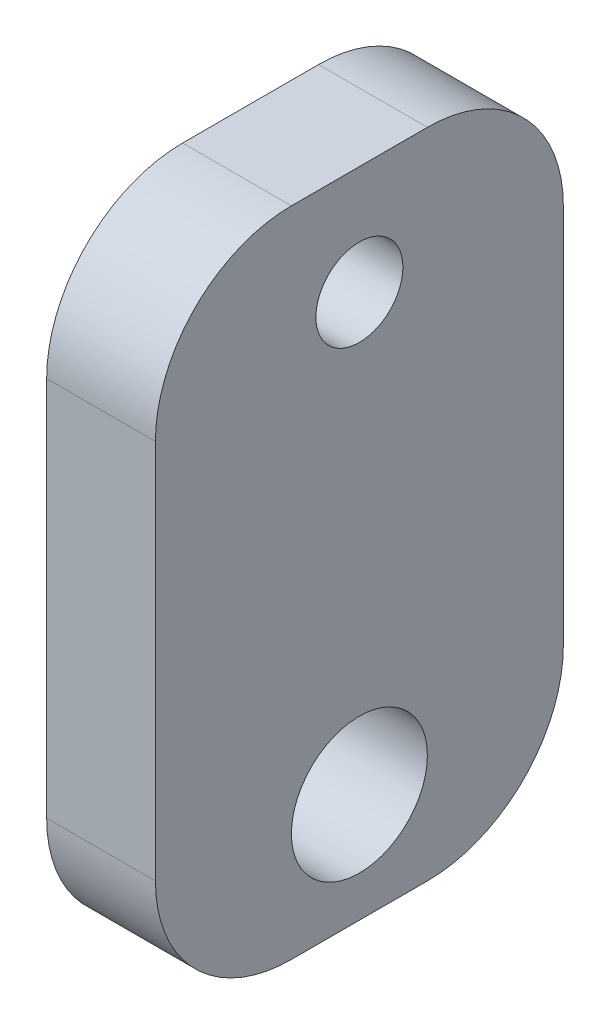
ISO-10303-21;
HEADER;
FILE_DESCRIPTION(('STEP AP214'),'2;1');
FILE_NAME('part.step','',(''),(''),'','','');
FILE_SCHEMA(('AUTOMOTIVE_DESIGN { 1 0 10303 214 1 1 1 1 }'));
ENDSEC;
DATA;
#1=APPLICATION_CONTEXT('core data for automotive mechanical design processes');
#2=APPLICATION_PROTOCOL_DEFINITION('international standard','automotive_design',2000,#1);
#3=PRODUCT_CONTEXT('',#1,'mechanical');
#4=PRODUCT('Part','Part','',(#3));
#5=PRODUCT_RELATED_PRODUCT_CATEGORY('part','',(#4));
#6=PRODUCT_DEFINITION_FORMATION('','',#4);
#7=PRODUCT_DEFINITION_CONTEXT('part definition',#1,'design');
#8=PRODUCT_DEFINITION('design','',#6,#7);
#9=PRODUCT_DEFINITION_SHAPE('','',#8);
#10=(LENGTH_UNIT() NAMED_UNIT(*) SI_UNIT(.MILLI.,.METRE.));
#11=(NAMED_UNIT(*) PLANE_ANGLE_UNIT() SI_UNIT($,.RADIAN.));
#12=(NAMED_UNIT(*) SI_UNIT($,.STERADIAN.) SOLID_ANGLE_UNIT());
#13=UNCERTAINTY_MEASURE_WITH_UNIT(LENGTH_MEASURE(1.E-05),#10,'distance_accuracy_value','');
#14=(GEOMETRIC_REPRESENTATION_CONTEXT(3) GLOBAL_UNCERTAINTY_ASSIGNED_CONTEXT((#13)) GLOBAL_UNIT_ASSIGNED_CONTEXT((#10,
#11,#12)) REPRESENTATION_CONTEXT('',''));
#15=CARTESIAN_POINT('',(0.,0.,0.));
#16=DIRECTION('',(0.,0.,1.));
#17=DIRECTION('',(1.,0.,0.));
#18=AXIS2_PLACEMENT_3D('',#15,#16,#17);
#19=CARTESIAN_POINT('',(4.,0.,0.));
#20=DIRECTION('',(0.,0.,-1.));
#21=DIRECTION('',(0.,1.,0.));
#22=AXIS2_PLACEMENT_3D('',#19,#20,#21);
#23=PLANE('',#22);
#24=DIRECTION('',(0.,-1.,0.));
#25=VECTOR('',#24,1.);
#26=CARTESIAN_POINT('',(0.,0.,0.));
#27=LINE('',#26,#25);
#28=CARTESIAN_POINT('',(0.,-5.,0.));
#29=VERTEX_POINT('',#28);
#30=CARTESIAN_POINT('',(0.,-19.,0.));
#31=VERTEX_POINT('',#30);
#32=EDGE_CURVE('E139',#29,#31,#27,.T.);
#33=ORIENTED_EDGE('',*,*,#32,.T.);
#34=DIRECTION('',(-1.,0.,0.));
#35=VECTOR('',#34,1.);
#36=CARTESIAN_POINT('',(4.,-19.,0.));
#37=LINE('',#36,#35);
#38=CARTESIAN_POINT('',(4.,-19.,0.));
#39=VERTEX_POINT('',#38);
#40=EDGE_CURVE('E162',#31,#39,#37,.F.);
#41=ORIENTED_EDGE('',*,*,#40,.T.);
#42=DIRECTION('',(0.,-1.,0.));
#43=VECTOR('',#42,1.);
#44=CARTESIAN_POINT('',(4.,0.,0.));
#45=LINE('',#44,#43);
#46=CARTESIAN_POINT('',(4.,-5.,0.));
#47=VERTEX_POINT('',#46);
#48=EDGE_CURVE('E137',#47,#39,#45,.T.);
#49=ORIENTED_EDGE('',*,*,#48,.F.);
#50=DIRECTION('',(-1.,0.,0.));
#51=VECTOR('',#50,1.);
#52=CARTESIAN_POINT('',(4.,-5.,0.));
#53=LINE('',#52,#51);
#54=EDGE_CURVE('E159',#47,#29,#53,.T.);
#55=ORIENTED_EDGE('',*,*,#54,.T.);
#56=EDGE_LOOP('',(#33,#41,#49,#55));
#57=FACE_BOUND('',#56,.T.);
#58=ADVANCED_FACE('F44',(#57),#23,.F.);
#59=CARTESIAN_POINT('',(4.,-24.,0.));
#60=DIRECTION('',(0.,1.,0.));
#61=DIRECTION('',(0.,0.,1.));
#62=AXIS2_PLACEMENT_3D('',#59,#60,#61);
#63=PLANE('',#62);
#64=DIRECTION('',(0.,0.,-1.));
#65=VECTOR('',#64,1.);
#66=CARTESIAN_POINT('',(0.,-24.,0.));
#67=LINE('',#66,#65);
#68=CARTESIAN_POINT('',(0.,-24.,-5.));
#69=VERTEX_POINT('',#68);
#70=CARTESIAN_POINT('',(0.,-24.,-10.));
#71=VERTEX_POINT('',#70);
#72=EDGE_CURVE('E135',#69,#71,#67,.T.);
#73=ORIENTED_EDGE('',*,*,#72,.T.);
#74=DIRECTION('',(-1.,0.,0.));
#75=VECTOR('',#74,1.);
#76=CARTESIAN_POINT('',(4.,-24.,-10.));
#77=LINE('',#76,#75);
#78=CARTESIAN_POINT('',(4.,-24.,-10.));
#79=VERTEX_POINT('',#78);
#80=EDGE_CURVE('E114',#71,#79,#77,.F.);
#81=ORIENTED_EDGE('',*,*,#80,.T.);
#82=DIRECTION('',(0.,0.,-1.));
#83=VECTOR('',#82,1.);
#84=CARTESIAN_POINT('',(4.,-24.,0.));
#85=LINE('',#84,#83);
#86=CARTESIAN_POINT('',(4.,-24.,-5.));
#87=VERTEX_POINT('',#86);
#88=EDGE_CURVE('E178',#87,#79,#85,.T.);
#89=ORIENTED_EDGE('',*,*,#88,.F.);
#90=DIRECTION('',(-1.,0.,0.));
#91=VECTOR('',#90,1.);
#92=CARTESIAN_POINT('',(4.,-24.,-5.));
#93=LINE('',#92,#91);
#94=EDGE_CURVE('E119',#87,#69,#93,.T.);
#95=ORIENTED_EDGE('',*,*,#94,.T.);
#96=EDGE_LOOP('',(#73,#81,#89,#95));
#97=FACE_BOUND('',#96,.T.);
#98=ADVANCED_FACE('F216',(#97),#63,.F.);
#99=CARTESIAN_POINT('',(4.,0.,-15.));
#100=DIRECTION('',(0.,0.,1.));
#101=DIRECTION('',(0.,-1.,0.));
#102=AXIS2_PLACEMENT_3D('',#99,#100,#101);
#103=PLANE('',#102);
#104=DIRECTION('',(0.,1.,0.));
#105=VECTOR('',#104,1.);
#106=CARTESIAN_POINT('',(4.,0.,-15.));
#107=LINE('',#106,#105);
#108=CARTESIAN_POINT('',(4.,-19.,-15.));
#109=VERTEX_POINT('',#108);
#110=CARTESIAN_POINT('',(4.,-5.,-15.));
#111=VERTEX_POINT('',#110);
#112=EDGE_CURVE('E128',#109,#111,#107,.T.);
#113=ORIENTED_EDGE('',*,*,#112,.F.);
#114=DIRECTION('',(-1.,0.,0.));
#115=VECTOR('',#114,1.);
#116=CARTESIAN_POINT('',(4.,-19.,-15.));
#117=LINE('',#116,#115);
#118=CARTESIAN_POINT('',(0.,-19.,-15.));
#119=VERTEX_POINT('',#118);
#120=EDGE_CURVE('E113',#109,#119,#117,.T.);
#121=ORIENTED_EDGE('',*,*,#120,.T.);
#122=DIRECTION('',(0.,1.,0.));
#123=VECTOR('',#122,1.);
#124=CARTESIAN_POINT('',(0.,0.,-15.));
#125=LINE('',#124,#123);
#126=CARTESIAN_POINT('',(0.,-5.,-15.));
#127=VERTEX_POINT('',#126);
#128=EDGE_CURVE('E126',#119,#127,#125,.T.);
#129=ORIENTED_EDGE('',*,*,#128,.T.);
#130=DIRECTION('',(-1.,0.,0.));
#131=VECTOR('',#130,1.);
#132=CARTESIAN_POINT('',(4.,-5.,-15.));
#133=LINE('',#132,#131);
#134=EDGE_CURVE('E130',#127,#111,#133,.F.);
#135=ORIENTED_EDGE('',*,*,#134,.T.);
#136=EDGE_LOOP('',(#113,#121,#129,#135));
#137=FACE_BOUND('',#136,.T.);
#138=ADVANCED_FACE('F125',(#137),#103,.F.);
#139=CARTESIAN_POINT('',(4.,0.,0.));
#140=DIRECTION('',(0.,-1.,0.));
#141=DIRECTION('',(0.,0.,-1.));
#142=AXIS2_PLACEMENT_3D('',#139,#140,#141);
#143=PLANE('',#142);
#144=DIRECTION('',(0.,0.,1.));
#145=VECTOR('',#144,1.);
#146=CARTESIAN_POINT('',(0.,0.,0.));
#147=LINE('',#146,#145);
#148=CARTESIAN_POINT('',(0.,0.,-10.));
#149=VERTEX_POINT('',#148);
#150=CARTESIAN_POINT('',(0.,0.,-5.));
#151=VERTEX_POINT('',#150);
#152=EDGE_CURVE('E134',#149,#151,#147,.T.);
#153=ORIENTED_EDGE('',*,*,#152,.T.);
#154=DIRECTION('',(-1.,0.,0.));
#155=VECTOR('',#154,1.);
#156=CARTESIAN_POINT('',(4.,0.,-5.));
#157=LINE('',#156,#155);
#158=CARTESIAN_POINT('',(4.,0.,-5.));
#159=VERTEX_POINT('',#158);
#160=EDGE_CURVE('E13',#151,#159,#157,.F.);
#161=ORIENTED_EDGE('',*,*,#160,.T.);
#162=DIRECTION('',(0.,0.,1.));
#163=VECTOR('',#162,1.);
#164=CARTESIAN_POINT('',(4.,0.,0.));
#165=LINE('',#164,#163);
#166=CARTESIAN_POINT('',(4.,0.,-10.));
#167=VERTEX_POINT('',#166);
#168=EDGE_CURVE('E143',#167,#159,#165,.T.);
#169=ORIENTED_EDGE('',*,*,#168,.F.);
#170=DIRECTION('',(-1.,0.,0.));
#171=VECTOR('',#170,1.);
#172=CARTESIAN_POINT('',(4.,0.,-10.));
#173=LINE('',#172,#171);
#174=EDGE_CURVE('E52',#167,#149,#173,.T.);
#175=ORIENTED_EDGE('',*,*,#174,.T.);
#176=EDGE_LOOP('',(#153,#161,#169,#175));
#177=FACE_BOUND('',#176,.T.);
#178=ADVANCED_FACE('F165',(#177),#143,.F.);
#179=CARTESIAN_POINT('',(4.,0.,0.));
#180=DIRECTION('',(1.,0.,0.));
#181=DIRECTION('',(0.,0.,-1.));
#182=AXIS2_PLACEMENT_3D('',#179,#180,#181);
#183=PLANE('',#182);
#184=CARTESIAN_POINT('',(4.,-4.,-7.5));
#185=DIRECTION('',(1.,0.,0.));
#186=DIRECTION('',(0.,0.,-1.));
#187=AXIS2_PLACEMENT_3D('',#184,#185,#186);
#188=CIRCLE('',#187,1.6);
#189=CARTESIAN_POINT('',(4.,-4.,-9.1));
#190=VERTEX_POINT('',#189);
#191=EDGE_CURVE('E194',#190,#190,#188,.T.);
#192=ORIENTED_EDGE('',*,*,#191,.F.);
#193=EDGE_LOOP('',(#192));
#194=FACE_BOUND('',#193,.T.);
#195=CARTESIAN_POINT('',(4.,-20.,-7.5));
#196=DIRECTION('',(1.,0.,0.));
#197=DIRECTION('',(0.,0.,-1.));
#198=AXIS2_PLACEMENT_3D('',#195,#196,#197);
#199=CIRCLE('',#198,2.5);
#200=CARTESIAN_POINT('',(4.,-20.,-10.));
#201=VERTEX_POINT('',#200);
#202=EDGE_CURVE('E183',#201,#201,#199,.T.);
#203=ORIENTED_EDGE('',*,*,#202,.F.);
#204=EDGE_LOOP('',(#203));
#205=FACE_BOUND('',#204,.T.);
#206=ORIENTED_EDGE('',*,*,#88,.T.);
#207=CARTESIAN_POINT('',(4.,-19.,-10.));
#208=DIRECTION('',(1.,0.,0.));
#209=DIRECTION('',(0.,0.,-1.));
#210=AXIS2_PLACEMENT_3D('',#207,#208,#209);
#211=CIRCLE('',#210,5.);
#212=EDGE_CURVE('E157',#79,#109,#211,.T.);
#213=ORIENTED_EDGE('',*,*,#212,.T.);
#214=ORIENTED_EDGE('',*,*,#112,.T.);
#215=CARTESIAN_POINT('',(4.,-5.,-10.));
#216=DIRECTION('',(1.,0.,0.));
#217=DIRECTION('',(0.,0.,-1.));
#218=AXIS2_PLACEMENT_3D('',#215,#216,#217);
#219=CIRCLE('',#218,5.);
#220=EDGE_CURVE('E64',#111,#167,#219,.T.);
#221=ORIENTED_EDGE('',*,*,#220,.T.);
#222=ORIENTED_EDGE('',*,*,#168,.T.);
#223=CARTESIAN_POINT('',(4.,-5.,-5.));
#224=DIRECTION('',(1.,0.,0.));
#225=DIRECTION('',(0.,0.,-1.));
#226=AXIS2_PLACEMENT_3D('',#223,#224,#225);
#227=CIRCLE('',#226,5.);
#228=EDGE_CURVE('E153',#159,#47,#227,.T.);
#229=ORIENTED_EDGE('',*,*,#228,.T.);
#230=ORIENTED_EDGE('',*,*,#48,.T.);
#231=CARTESIAN_POINT('',(4.,-19.,-5.));
#232=DIRECTION('',(1.,0.,0.));
#233=DIRECTION('',(0.,0.,-1.));
#234=AXIS2_PLACEMENT_3D('',#231,#232,#233);
#235=CIRCLE('',#234,5.);
#236=EDGE_CURVE('E155',#39,#87,#235,.T.);
#237=ORIENTED_EDGE('',*,*,#236,.T.);
#238=EDGE_LOOP('',(#206,#213,#214,#221,#222,#229,#230,#237));
#239=FACE_BOUND('',#238,.T.);
#240=ADVANCED_FACE('F208',(#194,#205,#239),#183,.T.);
#241=CARTESIAN_POINT('',(0.,0.,0.));
#242=DIRECTION('',(1.,0.,0.));
#243=DIRECTION('',(0.,0.,-1.));
#244=AXIS2_PLACEMENT_3D('',#241,#242,#243);
#245=PLANE('',#244);
#246=CARTESIAN_POINT('',(0.,-4.,-7.5));
#247=DIRECTION('',(1.,0.,0.));
#248=DIRECTION('',(0.,0.,-1.));
#249=AXIS2_PLACEMENT_3D('',#246,#247,#248);
#250=CIRCLE('',#249,1.6);
#251=CARTESIAN_POINT('',(0.,-4.,-9.1));
#252=VERTEX_POINT('',#251);
#253=EDGE_CURVE('E192',#252,#252,#250,.T.);
#254=ORIENTED_EDGE('',*,*,#253,.T.);
#255=EDGE_LOOP('',(#254));
#256=FACE_BOUND('',#255,.T.);
#257=CARTESIAN_POINT('',(0.,-20.,-7.5));
#258=DIRECTION('',(1.,0.,0.));
#259=DIRECTION('',(0.,0.,-1.));
#260=AXIS2_PLACEMENT_3D('',#257,#258,#259);
#261=CIRCLE('',#260,2.5);
#262=CARTESIAN_POINT('',(0.,-20.,-10.));
#263=VERTEX_POINT('',#262);
#264=EDGE_CURVE('E187',#263,#263,#261,.T.);
#265=ORIENTED_EDGE('',*,*,#264,.T.);
#266=EDGE_LOOP('',(#265));
#267=FACE_BOUND('',#266,.T.);
#268=ORIENTED_EDGE('',*,*,#128,.F.);
#269=CARTESIAN_POINT('',(0.,-19.,-10.));
#270=DIRECTION('',(1.,0.,0.));
#271=DIRECTION('',(0.,0.,-1.));
#272=AXIS2_PLACEMENT_3D('',#269,#270,#271);
#273=CIRCLE('',#272,5.);
#274=EDGE_CURVE('E109',#119,#71,#273,.F.);
#275=ORIENTED_EDGE('',*,*,#274,.T.);
#276=ORIENTED_EDGE('',*,*,#72,.F.);
#277=CARTESIAN_POINT('',(0.,-19.,-5.));
#278=DIRECTION('',(1.,0.,0.));
#279=DIRECTION('',(0.,0.,-1.));
#280=AXIS2_PLACEMENT_3D('',#277,#278,#279);
#281=CIRCLE('',#280,5.);
#282=EDGE_CURVE('E120',#69,#31,#281,.F.);
#283=ORIENTED_EDGE('',*,*,#282,.T.);
#284=ORIENTED_EDGE('',*,*,#32,.F.);
#285=CARTESIAN_POINT('',(0.,-5.,-5.));
#286=DIRECTION('',(1.,0.,0.));
#287=DIRECTION('',(0.,0.,-1.));
#288=AXIS2_PLACEMENT_3D('',#285,#286,#287);
#289=CIRCLE('',#288,5.);
#290=EDGE_CURVE('E146',#29,#151,#289,.F.);
#291=ORIENTED_EDGE('',*,*,#290,.T.);
#292=ORIENTED_EDGE('',*,*,#152,.F.);
#293=CARTESIAN_POINT('',(0.,-5.,-10.));
#294=DIRECTION('',(1.,0.,0.));
#295=DIRECTION('',(0.,0.,-1.));
#296=AXIS2_PLACEMENT_3D('',#293,#294,#295);
#297=CIRCLE('',#296,5.);
#298=EDGE_CURVE('E129',#149,#127,#297,.F.);
#299=ORIENTED_EDGE('',*,*,#298,.T.);
#300=EDGE_LOOP('',(#268,#275,#276,#283,#284,#291,#292,#299));
#301=FACE_BOUND('',#300,.T.);
#302=ADVANCED_FACE('F132',(#256,#267,#301),#245,.F.);
#303=CARTESIAN_POINT('',(0.,-20.,-7.5));
#304=DIRECTION('',(1.,0.,0.));
#305=DIRECTION('',(0.,0.,-1.));
#306=AXIS2_PLACEMENT_3D('',#303,#304,#305);
#307=CYLINDRICAL_SURFACE('',#306,2.5);
#308=ORIENTED_EDGE('',*,*,#264,.F.);
#309=EDGE_LOOP('',(#308));
#310=FACE_BOUND('',#309,.T.);
#311=ORIENTED_EDGE('',*,*,#202,.T.);
#312=EDGE_LOOP('',(#311));
#313=FACE_BOUND('',#312,.T.);
#314=ADVANCED_FACE('F204',(#310,#313),#307,.F.);
#315=CARTESIAN_POINT('',(0.,-4.,-7.5));
#316=DIRECTION('',(1.,0.,0.));
#317=DIRECTION('',(0.,0.,-1.));
#318=AXIS2_PLACEMENT_3D('',#315,#316,#317);
#319=CYLINDRICAL_SURFACE('',#318,1.6);
#320=ORIENTED_EDGE('',*,*,#253,.F.);
#321=EDGE_LOOP('',(#320));
#322=FACE_BOUND('',#321,.T.);
#323=ORIENTED_EDGE('',*,*,#191,.T.);
#324=EDGE_LOOP('',(#323));
#325=FACE_BOUND('',#324,.T.);
#326=ADVANCED_FACE('F201',(#322,#325),#319,.F.);
#327=CARTESIAN_POINT('',(4.,-19.,-10.));
#328=DIRECTION('',(-1.,0.,0.));
#329=DIRECTION('',(0.,0.,1.));
#330=AXIS2_PLACEMENT_3D('',#327,#328,#329);
#331=CYLINDRICAL_SURFACE('',#330,5.);
#332=ORIENTED_EDGE('',*,*,#212,.F.);
#333=ORIENTED_EDGE('',*,*,#80,.F.);
#334=ORIENTED_EDGE('',*,*,#274,.F.);
#335=ORIENTED_EDGE('',*,*,#120,.F.);
#336=EDGE_LOOP('',(#332,#333,#334,#335));
#337=FACE_BOUND('',#336,.T.);
#338=ADVANCED_FACE('F112',(#337),#331,.T.);
#339=CARTESIAN_POINT('',(4.,-19.,-5.));
#340=DIRECTION('',(-1.,0.,0.));
#341=DIRECTION('',(0.,0.,1.));
#342=AXIS2_PLACEMENT_3D('',#339,#340,#341);
#343=CYLINDRICAL_SURFACE('',#342,5.);
#344=ORIENTED_EDGE('',*,*,#236,.F.);
#345=ORIENTED_EDGE('',*,*,#40,.F.);
#346=ORIENTED_EDGE('',*,*,#282,.F.);
#347=ORIENTED_EDGE('',*,*,#94,.F.);
#348=EDGE_LOOP('',(#344,#345,#346,#347));
#349=FACE_BOUND('',#348,.T.);
#350=ADVANCED_FACE('F218',(#349),#343,.T.);
#351=CARTESIAN_POINT('',(4.,-5.,-5.));
#352=DIRECTION('',(-1.,0.,0.));
#353=DIRECTION('',(0.,0.,1.));
#354=AXIS2_PLACEMENT_3D('',#351,#352,#353);
#355=CYLINDRICAL_SURFACE('',#354,5.);
#356=ORIENTED_EDGE('',*,*,#228,.F.);
#357=ORIENTED_EDGE('',*,*,#160,.F.);
#358=ORIENTED_EDGE('',*,*,#290,.F.);
#359=ORIENTED_EDGE('',*,*,#54,.F.);
#360=EDGE_LOOP('',(#356,#357,#358,#359));
#361=FACE_BOUND('',#360,.T.);
#362=ADVANCED_FACE('F172',(#361),#355,.T.);
#363=CARTESIAN_POINT('',(4.,-5.,-10.));
#364=DIRECTION('',(-1.,0.,0.));
#365=DIRECTION('',(0.,0.,1.));
#366=AXIS2_PLACEMENT_3D('',#363,#364,#365);
#367=CYLINDRICAL_SURFACE('',#366,5.);
#368=ORIENTED_EDGE('',*,*,#220,.F.);
#369=ORIENTED_EDGE('',*,*,#134,.F.);
#370=ORIENTED_EDGE('',*,*,#298,.F.);
#371=ORIENTED_EDGE('',*,*,#174,.F.);
#372=EDGE_LOOP('',(#368,#369,#370,#371));
#373=FACE_BOUND('',#372,.T.);
#374=ADVANCED_FACE('F46',(#373),#367,.T.);
#375=CLOSED_SHELL('',(#58,#98,#138,#178,#240,#302,#314,#326,#338,#350,#362,#374));
#376=MANIFOLD_SOLID_BREP('B2',#375);
#377=ADVANCED_BREP_SHAPE_REPRESENTATION('',(#18,#376),#14);
#378=SHAPE_DEFINITION_REPRESENTATION(#9,#377);
ENDSEC;
END-ISO-10303-21;
